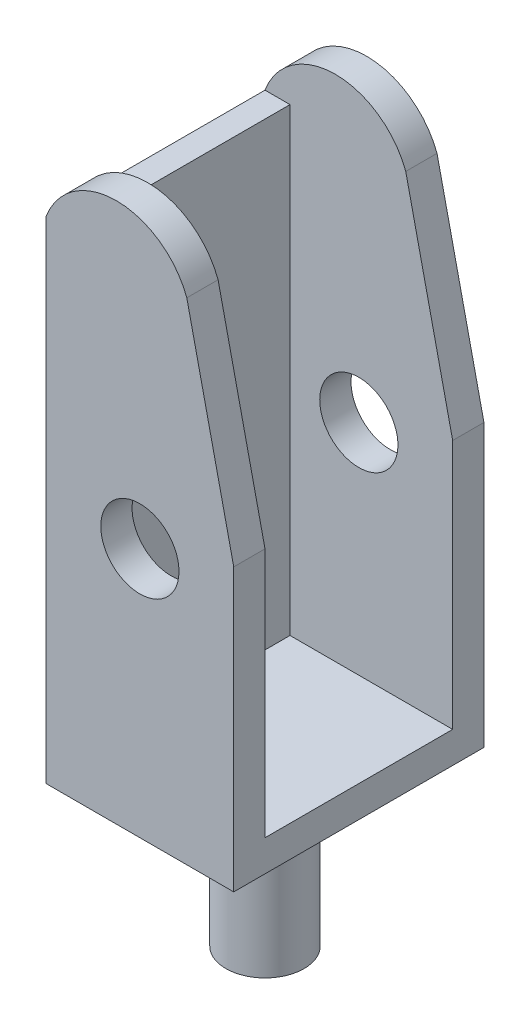
ISO-10303-21;
HEADER;
FILE_DESCRIPTION(('STEP AP214'),'2;1');
FILE_NAME('part.step','',(''),(''),'','','');
FILE_SCHEMA(('AUTOMOTIVE_DESIGN { 1 0 10303 214 1 1 1 1 }'));
ENDSEC;
DATA;
#1=APPLICATION_CONTEXT('core data for automotive mechanical design processes');
#2=APPLICATION_PROTOCOL_DEFINITION('international standard','automotive_design',2000,#1);
#3=PRODUCT_CONTEXT('',#1,'mechanical');
#4=PRODUCT('Part','Part','',(#3));
#5=PRODUCT_RELATED_PRODUCT_CATEGORY('part','',(#4));
#6=PRODUCT_DEFINITION_FORMATION('','',#4);
#7=PRODUCT_DEFINITION_CONTEXT('part definition',#1,'design');
#8=PRODUCT_DEFINITION('design','',#6,#7);
#9=PRODUCT_DEFINITION_SHAPE('','',#8);
#10=(LENGTH_UNIT() NAMED_UNIT(*) SI_UNIT(.MILLI.,.METRE.));
#11=(NAMED_UNIT(*) PLANE_ANGLE_UNIT() SI_UNIT($,.RADIAN.));
#12=(NAMED_UNIT(*) SI_UNIT($,.STERADIAN.) SOLID_ANGLE_UNIT());
#13=UNCERTAINTY_MEASURE_WITH_UNIT(LENGTH_MEASURE(1.E-05),#10,'distance_accuracy_value','');
#14=(GEOMETRIC_REPRESENTATION_CONTEXT(3) GLOBAL_UNCERTAINTY_ASSIGNED_CONTEXT((#13)) GLOBAL_UNIT_ASSIGNED_CONTEXT((#10,
#11,#12)) REPRESENTATION_CONTEXT('',''));
#15=CARTESIAN_POINT('',(0.,0.,0.));
#16=DIRECTION('',(0.,0.,1.));
#17=DIRECTION('',(1.,0.,0.));
#18=AXIS2_PLACEMENT_3D('',#15,#16,#17);
#19=CARTESIAN_POINT('',(-30.,-80.,40.));
#20=DIRECTION('',(1.,0.,0.));
#21=DIRECTION('',(0.,0.,-1.));
#22=AXIS2_PLACEMENT_3D('',#19,#20,#21);
#23=PLANE('',#22);
#24=DIRECTION('',(0.,0.,-1.));
#25=VECTOR('',#24,1.);
#26=CARTESIAN_POINT('',(-30.,77.,40.));
#27=LINE('',#26,#25);
#28=CARTESIAN_POINT('',(-30.,77.,40.));
#29=VERTEX_POINT('',#28);
#30=CARTESIAN_POINT('',(-30.,77.,30.));
#31=VERTEX_POINT('',#30);
#32=EDGE_CURVE('E185',#29,#31,#27,.T.);
#33=ORIENTED_EDGE('',*,*,#32,.T.);
#34=DIRECTION('',(0.,0.,-1.));
#35=VECTOR('',#34,1.);
#36=CARTESIAN_POINT('',(-30.,77.,-30.));
#37=LINE('',#36,#35);
#38=CARTESIAN_POINT('',(-30.,77.,-30.));
#39=VERTEX_POINT('',#38);
#40=EDGE_CURVE('E126',#31,#39,#37,.T.);
#41=ORIENTED_EDGE('',*,*,#40,.T.);
#42=DIRECTION('',(0.,0.,1.));
#43=VECTOR('',#42,1.);
#44=CARTESIAN_POINT('',(-30.,77.,-40.));
#45=LINE('',#44,#43);
#46=CARTESIAN_POINT('',(-30.,77.,-40.));
#47=VERTEX_POINT('',#46);
#48=EDGE_CURVE('E120',#47,#39,#45,.T.);
#49=ORIENTED_EDGE('',*,*,#48,.F.);
#50=DIRECTION('',(0.,-1.,0.));
#51=VECTOR('',#50,1.);
#52=CARTESIAN_POINT('',(-30.,-80.,-40.));
#53=LINE('',#52,#51);
#54=CARTESIAN_POINT('',(-30.,-80.,-40.));
#55=VERTEX_POINT('',#54);
#56=EDGE_CURVE('E124',#47,#55,#53,.T.);
#57=ORIENTED_EDGE('',*,*,#56,.T.);
#58=DIRECTION('',(0.,0.,-1.));
#59=VECTOR('',#58,1.);
#60=CARTESIAN_POINT('',(-30.,-80.,40.));
#61=LINE('',#60,#59);
#62=CARTESIAN_POINT('',(-30.,-80.,40.));
#63=VERTEX_POINT('',#62);
#64=EDGE_CURVE('E42',#63,#55,#61,.T.);
#65=ORIENTED_EDGE('',*,*,#64,.F.);
#66=DIRECTION('',(0.,-1.,0.));
#67=VECTOR('',#66,1.);
#68=CARTESIAN_POINT('',(-30.,-80.,40.));
#69=LINE('',#68,#67);
#70=EDGE_CURVE('E173',#29,#63,#69,.T.);
#71=ORIENTED_EDGE('',*,*,#70,.F.);
#72=EDGE_LOOP('',(#33,#41,#49,#57,#65,#71));
#73=FACE_BOUND('',#72,.T.);
#74=ADVANCED_FACE('F34',(#73),#23,.F.);
#75=CARTESIAN_POINT('',(0.,-80.,40.));
#76=DIRECTION('',(0.,1.,0.));
#77=DIRECTION('',(0.,0.,1.));
#78=AXIS2_PLACEMENT_3D('',#75,#76,#77);
#79=PLANE('',#78);
#80=CARTESIAN_POINT('',(0.,-80.,0.));
#81=DIRECTION('',(0.,-1.,0.));
#82=DIRECTION('',(0.,0.,-1.));
#83=AXIS2_PLACEMENT_3D('',#80,#81,#82);
#84=CIRCLE('',#83,12.5);
#85=CARTESIAN_POINT('',(0.,-80.,-12.5));
#86=VERTEX_POINT('',#85);
#87=EDGE_CURVE('E11',#86,#86,#84,.T.);
#88=ORIENTED_EDGE('',*,*,#87,.F.);
#89=EDGE_LOOP('',(#88));
#90=FACE_BOUND('',#89,.T.);
#91=ORIENTED_EDGE('',*,*,#64,.T.);
#92=DIRECTION('',(1.,0.,0.));
#93=VECTOR('',#92,1.);
#94=CARTESIAN_POINT('',(0.,-80.,-40.));
#95=LINE('',#94,#93);
#96=CARTESIAN_POINT('',(30.,-80.,-40.));
#97=VERTEX_POINT('',#96);
#98=EDGE_CURVE('E143',#55,#97,#95,.T.);
#99=ORIENTED_EDGE('',*,*,#98,.T.);
#100=DIRECTION('',(0.,0.,-1.));
#101=VECTOR('',#100,1.);
#102=CARTESIAN_POINT('',(30.,-80.,40.));
#103=LINE('',#102,#101);
#104=CARTESIAN_POINT('',(30.,-80.,40.));
#105=VERTEX_POINT('',#104);
#106=EDGE_CURVE('E198',#105,#97,#103,.T.);
#107=ORIENTED_EDGE('',*,*,#106,.F.);
#108=DIRECTION('',(1.,0.,0.));
#109=VECTOR('',#108,1.);
#110=CARTESIAN_POINT('',(0.,-80.,40.));
#111=LINE('',#110,#109);
#112=EDGE_CURVE('E176',#63,#105,#111,.T.);
#113=ORIENTED_EDGE('',*,*,#112,.F.);
#114=EDGE_LOOP('',(#91,#99,#107,#113));
#115=FACE_BOUND('',#114,.T.);
#116=ADVANCED_FACE('F200',(#90,#115),#79,.F.);
#117=CARTESIAN_POINT('',(30.,-80.,40.));
#118=DIRECTION('',(-1.,0.,0.));
#119=DIRECTION('',(0.,0.,1.));
#120=AXIS2_PLACEMENT_3D('',#117,#118,#119);
#121=PLANE('',#120);
#122=ORIENTED_EDGE('',*,*,#106,.T.);
#123=DIRECTION('',(0.,1.,0.));
#124=VECTOR('',#123,1.);
#125=CARTESIAN_POINT('',(30.,-80.,-40.));
#126=LINE('',#125,#124);
#127=CARTESIAN_POINT('',(30.,9.99999999999999,-40.));
#128=VERTEX_POINT('',#127);
#129=EDGE_CURVE('E149',#97,#128,#126,.T.);
#130=ORIENTED_EDGE('',*,*,#129,.T.);
#131=DIRECTION('',(0.,0.,1.));
#132=VECTOR('',#131,1.);
#133=CARTESIAN_POINT('',(30.,9.99999999999999,-40.));
#134=LINE('',#133,#132);
#135=CARTESIAN_POINT('',(30.,9.99999999999999,-30.));
#136=VERTEX_POINT('',#135);
#137=EDGE_CURVE('E156',#128,#136,#134,.T.);
#138=ORIENTED_EDGE('',*,*,#137,.T.);
#139=DIRECTION('',(0.,1.,0.));
#140=VECTOR('',#139,1.);
#141=CARTESIAN_POINT('',(30.,-80.,-30.));
#142=LINE('',#141,#140);
#143=CARTESIAN_POINT('',(30.,-70.,-30.));
#144=VERTEX_POINT('',#143);
#145=EDGE_CURVE('E144',#144,#136,#142,.T.);
#146=ORIENTED_EDGE('',*,*,#145,.F.);
#147=DIRECTION('',(0.,0.,1.));
#148=VECTOR('',#147,1.);
#149=CARTESIAN_POINT('',(30.,-70.,30.));
#150=LINE('',#149,#148);
#151=CARTESIAN_POINT('',(30.,-70.,30.));
#152=VERTEX_POINT('',#151);
#153=EDGE_CURVE('E168',#144,#152,#150,.T.);
#154=ORIENTED_EDGE('',*,*,#153,.T.);
#155=DIRECTION('',(0.,1.,0.));
#156=VECTOR('',#155,1.);
#157=CARTESIAN_POINT('',(30.,-80.,30.));
#158=LINE('',#157,#156);
#159=CARTESIAN_POINT('',(30.,9.99999999999999,30.));
#160=VERTEX_POINT('',#159);
#161=EDGE_CURVE('E172',#152,#160,#158,.T.);
#162=ORIENTED_EDGE('',*,*,#161,.T.);
#163=DIRECTION('',(0.,0.,-1.));
#164=VECTOR('',#163,1.);
#165=CARTESIAN_POINT('',(30.,9.99999999999999,40.));
#166=LINE('',#165,#164);
#167=CARTESIAN_POINT('',(30.,9.99999999999999,40.));
#168=VERTEX_POINT('',#167);
#169=EDGE_CURVE('E195',#168,#160,#166,.T.);
#170=ORIENTED_EDGE('',*,*,#169,.F.);
#171=DIRECTION('',(0.,1.,0.));
#172=VECTOR('',#171,1.);
#173=CARTESIAN_POINT('',(30.,-80.,40.));
#174=LINE('',#173,#172);
#175=EDGE_CURVE('E179',#105,#168,#174,.T.);
#176=ORIENTED_EDGE('',*,*,#175,.F.);
#177=EDGE_LOOP('',(#122,#130,#138,#146,#154,#162,#170,#176));
#178=FACE_BOUND('',#177,.T.);
#179=ADVANCED_FACE('F265',(#178),#121,.F.);
#180=CARTESIAN_POINT('',(15.,77.,40.));
#181=DIRECTION('',(-0.975843140333233,-0.218472344850724,0.));
#182=DIRECTION('',(0.218472344850724,-0.975843140333233,0.));
#183=AXIS2_PLACEMENT_3D('',#180,#181,#182);
#184=PLANE('',#183);
#185=DIRECTION('',(-0.218472344850724,0.975843140333233,0.));
#186=VECTOR('',#185,1.);
#187=CARTESIAN_POINT('',(15.,77.,30.));
#188=LINE('',#187,#186);
#189=CARTESIAN_POINT('',(15.,77.,30.));
#190=VERTEX_POINT('',#189);
#191=EDGE_CURVE('E187',#160,#190,#188,.T.);
#192=ORIENTED_EDGE('',*,*,#191,.T.);
#193=DIRECTION('',(0.,0.,-1.));
#194=VECTOR('',#193,1.);
#195=CARTESIAN_POINT('',(15.,77.,40.));
#196=LINE('',#195,#194);
#197=CARTESIAN_POINT('',(15.,77.,40.));
#198=VERTEX_POINT('',#197);
#199=EDGE_CURVE('E192',#198,#190,#196,.T.);
#200=ORIENTED_EDGE('',*,*,#199,.F.);
#201=DIRECTION('',(-0.218472344850724,0.975843140333233,0.));
#202=VECTOR('',#201,1.);
#203=CARTESIAN_POINT('',(15.,77.,40.));
#204=LINE('',#203,#202);
#205=EDGE_CURVE('E181',#168,#198,#204,.T.);
#206=ORIENTED_EDGE('',*,*,#205,.F.);
#207=ORIENTED_EDGE('',*,*,#169,.T.);
#208=EDGE_LOOP('',(#192,#200,#206,#207));
#209=FACE_BOUND('',#208,.T.);
#210=ADVANCED_FACE('F270',(#209),#184,.F.);
#211=CARTESIAN_POINT('',(-7.49999999999999,68.648353455755,40.));
#212=DIRECTION('',(0.,0.,-1.));
#213=DIRECTION('',(-1.,0.,0.));
#214=AXIS2_PLACEMENT_3D('',#211,#212,#213);
#215=CYLINDRICAL_SURFACE('',#214,24.);
#216=CARTESIAN_POINT('',(-7.49999999999999,68.648353455755,30.));
#217=DIRECTION('',(0.,0.,1.));
#218=DIRECTION('',(1.,0.,0.));
#219=AXIS2_PLACEMENT_3D('',#216,#217,#218);
#220=CIRCLE('',#219,24.);
#221=EDGE_CURVE('E177',#190,#31,#220,.T.);
#222=ORIENTED_EDGE('',*,*,#221,.T.);
#223=ORIENTED_EDGE('',*,*,#32,.F.);
#224=CARTESIAN_POINT('',(-7.49999999999999,68.648353455755,40.));
#225=DIRECTION('',(0.,0.,1.));
#226=DIRECTION('',(1.,0.,0.));
#227=AXIS2_PLACEMENT_3D('',#224,#225,#226);
#228=CIRCLE('',#227,24.);
#229=EDGE_CURVE('E183',#198,#29,#228,.T.);
#230=ORIENTED_EDGE('',*,*,#229,.F.);
#231=ORIENTED_EDGE('',*,*,#199,.T.);
#232=EDGE_LOOP('',(#222,#223,#230,#231));
#233=FACE_BOUND('',#232,.T.);
#234=ADVANCED_FACE('F210',(#233),#215,.T.);
#235=CARTESIAN_POINT('',(-7.49999999999999,68.648353455755,40.));
#236=DIRECTION('',(0.,0.,1.));
#237=DIRECTION('',(1.,0.,0.));
#238=AXIS2_PLACEMENT_3D('',#235,#236,#237);
#239=PLANE('',#238);
#240=CARTESIAN_POINT('',(0.,0.,40.));
#241=DIRECTION('',(0.,0.,1.));
#242=DIRECTION('',(1.,0.,0.));
#243=AXIS2_PLACEMENT_3D('',#240,#241,#242);
#244=CIRCLE('',#243,12.5);
#245=CARTESIAN_POINT('',(12.5,0.,40.));
#246=VERTEX_POINT('',#245);
#247=EDGE_CURVE('E224',#246,#246,#244,.T.);
#248=ORIENTED_EDGE('',*,*,#247,.F.);
#249=EDGE_LOOP('',(#248));
#250=FACE_BOUND('',#249,.T.);
#251=ORIENTED_EDGE('',*,*,#70,.T.);
#252=ORIENTED_EDGE('',*,*,#112,.T.);
#253=ORIENTED_EDGE('',*,*,#175,.T.);
#254=ORIENTED_EDGE('',*,*,#205,.T.);
#255=ORIENTED_EDGE('',*,*,#229,.T.);
#256=EDGE_LOOP('',(#251,#252,#253,#254,#255));
#257=FACE_BOUND('',#256,.T.);
#258=ADVANCED_FACE('F205',(#250,#257),#239,.T.);
#259=CARTESIAN_POINT('',(-7.49999999999999,68.648353455755,30.));
#260=DIRECTION('',(0.,0.,1.));
#261=DIRECTION('',(1.,0.,0.));
#262=AXIS2_PLACEMENT_3D('',#259,#260,#261);
#263=PLANE('',#262);
#264=CARTESIAN_POINT('',(0.,0.,30.));
#265=DIRECTION('',(0.,0.,1.));
#266=DIRECTION('',(1.,0.,0.));
#267=AXIS2_PLACEMENT_3D('',#264,#265,#266);
#268=CIRCLE('',#267,12.5);
#269=CARTESIAN_POINT('',(12.5,0.,30.));
#270=VERTEX_POINT('',#269);
#271=EDGE_CURVE('E232',#270,#270,#268,.T.);
#272=ORIENTED_EDGE('',*,*,#271,.T.);
#273=EDGE_LOOP('',(#272));
#274=FACE_BOUND('',#273,.T.);
#275=DIRECTION('',(0.,1.,0.));
#276=VECTOR('',#275,1.);
#277=CARTESIAN_POINT('',(-22.,77.,30.));
#278=LINE('',#277,#276);
#279=CARTESIAN_POINT('',(-22.,-70.,30.));
#280=VERTEX_POINT('',#279);
#281=CARTESIAN_POINT('',(-22.,77.,30.));
#282=VERTEX_POINT('',#281);
#283=EDGE_CURVE('E50',#280,#282,#278,.T.);
#284=ORIENTED_EDGE('',*,*,#283,.T.);
#285=DIRECTION('',(-1.,0.,0.));
#286=VECTOR('',#285,1.);
#287=CARTESIAN_POINT('',(-22.,77.,30.));
#288=LINE('',#287,#286);
#289=EDGE_CURVE('E160',#282,#31,#288,.T.);
#290=ORIENTED_EDGE('',*,*,#289,.T.);
#291=ORIENTED_EDGE('',*,*,#221,.F.);
#292=ORIENTED_EDGE('',*,*,#191,.F.);
#293=ORIENTED_EDGE('',*,*,#161,.F.);
#294=DIRECTION('',(-1.,0.,0.));
#295=VECTOR('',#294,1.);
#296=CARTESIAN_POINT('',(-30.,-70.,30.));
#297=LINE('',#296,#295);
#298=EDGE_CURVE('E170',#152,#280,#297,.T.);
#299=ORIENTED_EDGE('',*,*,#298,.T.);
#300=EDGE_LOOP('',(#284,#290,#291,#292,#293,#299));
#301=FACE_BOUND('',#300,.T.);
#302=ADVANCED_FACE('F213',(#274,#301),#263,.F.);
#303=CARTESIAN_POINT('',(0.,-70.,0.));
#304=DIRECTION('',(0.,1.,0.));
#305=DIRECTION('',(0.,0.,1.));
#306=AXIS2_PLACEMENT_3D('',#303,#304,#305);
#307=PLANE('',#306);
#308=DIRECTION('',(0.,0.,1.));
#309=VECTOR('',#308,1.);
#310=CARTESIAN_POINT('',(-22.,-70.,-30.));
#311=LINE('',#310,#309);
#312=CARTESIAN_POINT('',(-22.,-70.,-30.));
#313=VERTEX_POINT('',#312);
#314=EDGE_CURVE('E58',#313,#280,#311,.T.);
#315=ORIENTED_EDGE('',*,*,#314,.T.);
#316=ORIENTED_EDGE('',*,*,#298,.F.);
#317=ORIENTED_EDGE('',*,*,#153,.F.);
#318=DIRECTION('',(1.,0.,0.));
#319=VECTOR('',#318,1.);
#320=CARTESIAN_POINT('',(30.,-70.,-30.));
#321=LINE('',#320,#319);
#322=EDGE_CURVE('E131',#313,#144,#321,.T.);
#323=ORIENTED_EDGE('',*,*,#322,.F.);
#324=EDGE_LOOP('',(#315,#316,#317,#323));
#325=FACE_BOUND('',#324,.T.);
#326=ADVANCED_FACE('F282',(#325),#307,.T.);
#327=CARTESIAN_POINT('',(-7.49999999999999,68.648353455755,-30.));
#328=DIRECTION('',(0.,0.,-1.));
#329=DIRECTION('',(1.,0.,0.));
#330=AXIS2_PLACEMENT_3D('',#327,#328,#329);
#331=PLANE('',#330);
#332=CARTESIAN_POINT('',(0.,0.,-30.));
#333=DIRECTION('',(0.,0.,-1.));
#334=DIRECTION('',(-1.,0.,0.));
#335=AXIS2_PLACEMENT_3D('',#332,#333,#334);
#336=CIRCLE('',#335,12.5);
#337=CARTESIAN_POINT('',(-12.5,0.,-30.));
#338=VERTEX_POINT('',#337);
#339=EDGE_CURVE('E235',#338,#338,#336,.T.);
#340=ORIENTED_EDGE('',*,*,#339,.T.);
#341=EDGE_LOOP('',(#340));
#342=FACE_BOUND('',#341,.T.);
#343=CARTESIAN_POINT('',(-7.49999999999999,68.648353455755,-30.));
#344=DIRECTION('',(0.,0.,1.));
#345=DIRECTION('',(1.,0.,0.));
#346=AXIS2_PLACEMENT_3D('',#343,#344,#345);
#347=CIRCLE('',#346,24.);
#348=CARTESIAN_POINT('',(15.,77.,-30.));
#349=VERTEX_POINT('',#348);
#350=EDGE_CURVE('E157',#349,#39,#347,.T.);
#351=ORIENTED_EDGE('',*,*,#350,.T.);
#352=DIRECTION('',(-1.,0.,0.));
#353=VECTOR('',#352,1.);
#354=CARTESIAN_POINT('',(-22.,77.,-30.));
#355=LINE('',#354,#353);
#356=CARTESIAN_POINT('',(-22.,77.,-30.));
#357=VERTEX_POINT('',#356);
#358=EDGE_CURVE('E218',#357,#39,#355,.T.);
#359=ORIENTED_EDGE('',*,*,#358,.F.);
#360=DIRECTION('',(0.,-1.,0.));
#361=VECTOR('',#360,1.);
#362=CARTESIAN_POINT('',(-22.,77.,-30.));
#363=LINE('',#362,#361);
#364=EDGE_CURVE('E227',#357,#313,#363,.T.);
#365=ORIENTED_EDGE('',*,*,#364,.T.);
#366=ORIENTED_EDGE('',*,*,#322,.T.);
#367=ORIENTED_EDGE('',*,*,#145,.T.);
#368=DIRECTION('',(-0.218472344850724,0.975843140333233,0.));
#369=VECTOR('',#368,1.);
#370=CARTESIAN_POINT('',(15.,77.,-30.));
#371=LINE('',#370,#369);
#372=EDGE_CURVE('E159',#136,#349,#371,.T.);
#373=ORIENTED_EDGE('',*,*,#372,.T.);
#374=EDGE_LOOP('',(#351,#359,#365,#366,#367,#373));
#375=FACE_BOUND('',#374,.T.);
#376=ADVANCED_FACE('F289',(#342,#375),#331,.F.);
#377=CARTESIAN_POINT('',(-7.49999999999999,68.648353455755,-40.));
#378=DIRECTION('',(0.,0.,1.));
#379=DIRECTION('',(1.,0.,0.));
#380=AXIS2_PLACEMENT_3D('',#377,#378,#379);
#381=CYLINDRICAL_SURFACE('',#380,24.);
#382=ORIENTED_EDGE('',*,*,#350,.F.);
#383=DIRECTION('',(0.,0.,1.));
#384=VECTOR('',#383,1.);
#385=CARTESIAN_POINT('',(15.,77.,-40.));
#386=LINE('',#385,#384);
#387=CARTESIAN_POINT('',(15.,77.,-40.));
#388=VERTEX_POINT('',#387);
#389=EDGE_CURVE('E132',#388,#349,#386,.T.);
#390=ORIENTED_EDGE('',*,*,#389,.F.);
#391=CARTESIAN_POINT('',(-7.49999999999999,68.648353455755,-40.));
#392=DIRECTION('',(0.,0.,1.));
#393=DIRECTION('',(1.,0.,0.));
#394=AXIS2_PLACEMENT_3D('',#391,#392,#393);
#395=CIRCLE('',#394,24.);
#396=EDGE_CURVE('E139',#388,#47,#395,.T.);
#397=ORIENTED_EDGE('',*,*,#396,.T.);
#398=ORIENTED_EDGE('',*,*,#48,.T.);
#399=EDGE_LOOP('',(#382,#390,#397,#398));
#400=FACE_BOUND('',#399,.T.);
#401=ADVANCED_FACE('F146',(#400),#381,.T.);
#402=CARTESIAN_POINT('',(15.,77.,-40.));
#403=DIRECTION('',(0.975843140333233,0.218472344850724,0.));
#404=DIRECTION('',(-0.218472344850724,0.975843140333233,0.));
#405=AXIS2_PLACEMENT_3D('',#402,#403,#404);
#406=PLANE('',#405);
#407=ORIENTED_EDGE('',*,*,#372,.F.);
#408=ORIENTED_EDGE('',*,*,#137,.F.);
#409=DIRECTION('',(-0.218472344850724,0.975843140333233,0.));
#410=VECTOR('',#409,1.);
#411=CARTESIAN_POINT('',(15.,77.,-40.));
#412=LINE('',#411,#410);
#413=EDGE_CURVE('E147',#128,#388,#412,.T.);
#414=ORIENTED_EDGE('',*,*,#413,.T.);
#415=ORIENTED_EDGE('',*,*,#389,.T.);
#416=EDGE_LOOP('',(#407,#408,#414,#415));
#417=FACE_BOUND('',#416,.T.);
#418=ADVANCED_FACE('F250',(#417),#406,.T.);
#419=CARTESIAN_POINT('',(-7.49999999999999,68.648353455755,-40.));
#420=DIRECTION('',(0.,0.,-1.));
#421=DIRECTION('',(1.,0.,0.));
#422=AXIS2_PLACEMENT_3D('',#419,#420,#421);
#423=PLANE('',#422);
#424=CARTESIAN_POINT('',(0.,0.,-40.));
#425=DIRECTION('',(0.,0.,-1.));
#426=DIRECTION('',(-1.,0.,0.));
#427=AXIS2_PLACEMENT_3D('',#424,#425,#426);
#428=CIRCLE('',#427,12.5);
#429=CARTESIAN_POINT('',(-12.5,0.,-40.));
#430=VERTEX_POINT('',#429);
#431=EDGE_CURVE('E37',#430,#430,#428,.T.);
#432=ORIENTED_EDGE('',*,*,#431,.F.);
#433=EDGE_LOOP('',(#432));
#434=FACE_BOUND('',#433,.T.);
#435=ORIENTED_EDGE('',*,*,#56,.F.);
#436=ORIENTED_EDGE('',*,*,#396,.F.);
#437=ORIENTED_EDGE('',*,*,#413,.F.);
#438=ORIENTED_EDGE('',*,*,#129,.F.);
#439=ORIENTED_EDGE('',*,*,#98,.F.);
#440=EDGE_LOOP('',(#435,#436,#437,#438,#439));
#441=FACE_BOUND('',#440,.T.);
#442=ADVANCED_FACE('F137',(#434,#441),#423,.T.);
#443=CARTESIAN_POINT('',(-22.,77.,-30.));
#444=DIRECTION('',(0.,1.,0.));
#445=DIRECTION('',(0.,0.,1.));
#446=AXIS2_PLACEMENT_3D('',#443,#444,#445);
#447=PLANE('',#446);
#448=ORIENTED_EDGE('',*,*,#40,.F.);
#449=ORIENTED_EDGE('',*,*,#289,.F.);
#450=DIRECTION('',(0.,0.,-1.));
#451=VECTOR('',#450,1.);
#452=CARTESIAN_POINT('',(-22.,77.,-30.));
#453=LINE('',#452,#451);
#454=EDGE_CURVE('E223',#282,#357,#453,.T.);
#455=ORIENTED_EDGE('',*,*,#454,.T.);
#456=ORIENTED_EDGE('',*,*,#358,.T.);
#457=EDGE_LOOP('',(#448,#449,#455,#456));
#458=FACE_BOUND('',#457,.T.);
#459=ADVANCED_FACE('F249',(#458),#447,.T.);
#460=CARTESIAN_POINT('',(-22.,0.,0.));
#461=DIRECTION('',(1.,0.,0.));
#462=DIRECTION('',(0.,0.,-1.));
#463=AXIS2_PLACEMENT_3D('',#460,#461,#462);
#464=PLANE('',#463);
#465=ORIENTED_EDGE('',*,*,#454,.F.);
#466=ORIENTED_EDGE('',*,*,#283,.F.);
#467=ORIENTED_EDGE('',*,*,#314,.F.);
#468=ORIENTED_EDGE('',*,*,#364,.F.);
#469=EDGE_LOOP('',(#465,#466,#467,#468));
#470=FACE_BOUND('',#469,.T.);
#471=ADVANCED_FACE('F256',(#470),#464,.T.);
#472=CARTESIAN_POINT('',(0.,0.,-72.));
#473=DIRECTION('',(0.,0.,1.));
#474=DIRECTION('',(1.,0.,0.));
#475=AXIS2_PLACEMENT_3D('',#472,#473,#474);
#476=CYLINDRICAL_SURFACE('',#475,12.5);
#477=ORIENTED_EDGE('',*,*,#431,.T.);
#478=EDGE_LOOP('',(#477));
#479=FACE_BOUND('',#478,.T.);
#480=ORIENTED_EDGE('',*,*,#339,.F.);
#481=EDGE_LOOP('',(#480));
#482=FACE_BOUND('',#481,.T.);
#483=ADVANCED_FACE('F245',(#479,#482),#476,.F.);
#484=ORIENTED_EDGE('',*,*,#247,.T.);
#485=EDGE_LOOP('',(#484));
#486=FACE_BOUND('',#485,.T.);
#487=ORIENTED_EDGE('',*,*,#271,.F.);
#488=EDGE_LOOP('',(#487));
#489=FACE_BOUND('',#488,.T.);
#490=ADVANCED_FACE('F309',(#486,#489),#476,.F.);
#491=CARTESIAN_POINT('',(0.,-130.,0.));
#492=DIRECTION('',(0.,1.,0.));
#493=DIRECTION('',(0.,0.,1.));
#494=AXIS2_PLACEMENT_3D('',#491,#492,#493);
#495=CYLINDRICAL_SURFACE('',#494,12.5);
#496=CARTESIAN_POINT('',(0.,-130.,0.));
#497=DIRECTION('',(0.,-1.,0.));
#498=DIRECTION('',(0.,0.,-1.));
#499=AXIS2_PLACEMENT_3D('',#496,#497,#498);
#500=CIRCLE('',#499,12.5);
#501=CARTESIAN_POINT('',(0.,-130.,-12.5));
#502=VERTEX_POINT('',#501);
#503=EDGE_CURVE('E238',#502,#502,#500,.T.);
#504=ORIENTED_EDGE('',*,*,#503,.F.);
#505=EDGE_LOOP('',(#504));
#506=FACE_BOUND('',#505,.T.);
#507=ORIENTED_EDGE('',*,*,#87,.T.);
#508=EDGE_LOOP('',(#507));
#509=FACE_BOUND('',#508,.T.);
#510=ADVANCED_FACE('F313',(#506,#509),#495,.T.);
#511=CARTESIAN_POINT('',(0.,-130.,0.));
#512=DIRECTION('',(0.,-1.,0.));
#513=DIRECTION('',(0.,0.,-1.));
#514=AXIS2_PLACEMENT_3D('',#511,#512,#513);
#515=PLANE('',#514);
#516=ORIENTED_EDGE('',*,*,#503,.T.);
#517=EDGE_LOOP('',(#516));
#518=FACE_BOUND('',#517,.T.);
#519=ADVANCED_FACE('F317',(#518),#515,.T.);
#520=CLOSED_SHELL('',(#74,#116,#179,#210,#234,#258,#302,#326,#376,#401,#418,#442,#459,#471,#483,
#490,#510,#519));
#521=MANIFOLD_SOLID_BREP('B2',#520);
#522=ADVANCED_BREP_SHAPE_REPRESENTATION('',(#18,#521),#14);
#523=SHAPE_DEFINITION_REPRESENTATION(#9,#522);
ENDSEC;
END-ISO-10303-21;
